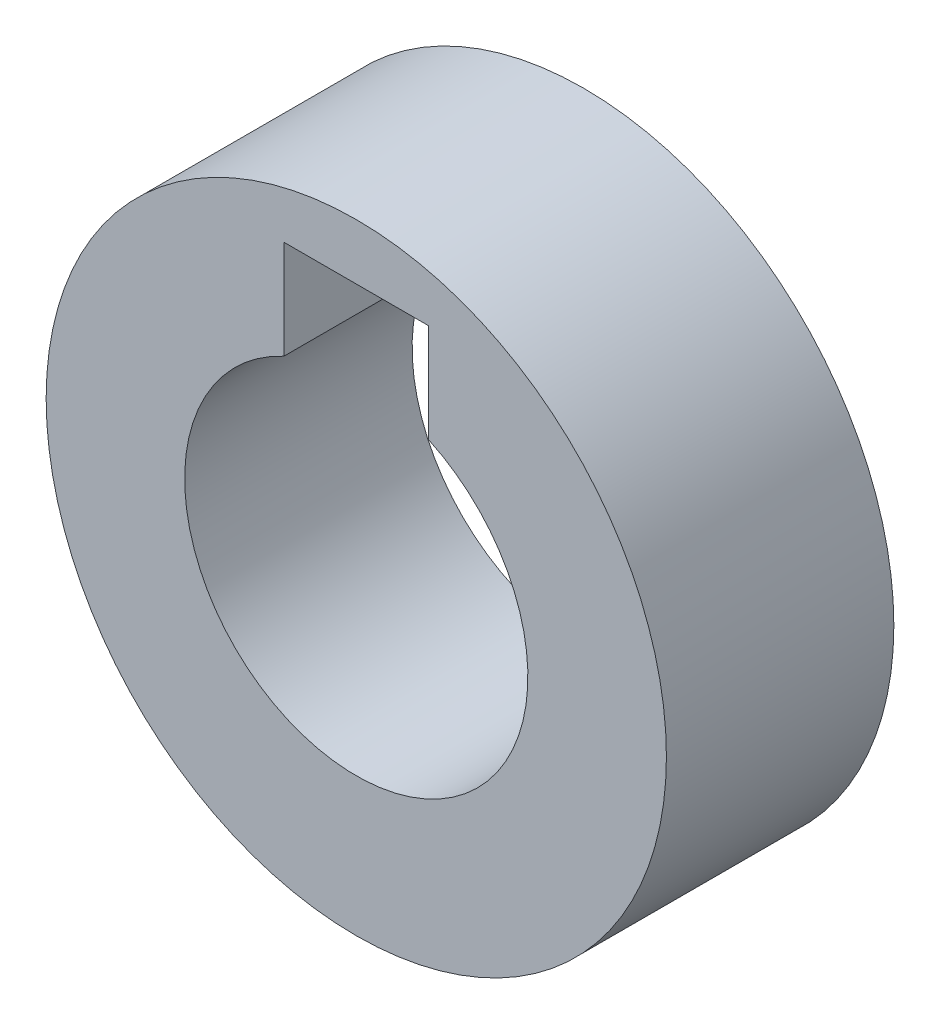
ISO-10303-21;
HEADER;
FILE_DESCRIPTION(('STEP AP214'),'2;1');
FILE_NAME('part.step','',(''),(''),'','','');
FILE_SCHEMA(('AUTOMOTIVE_DESIGN { 1 0 10303 214 1 1 1 1 }'));
ENDSEC;
DATA;
#1=APPLICATION_CONTEXT('core data for automotive mechanical design processes');
#2=APPLICATION_PROTOCOL_DEFINITION('international standard','automotive_design',2000,#1);
#3=PRODUCT_CONTEXT('',#1,'mechanical');
#4=PRODUCT('Part','Part','',(#3));
#5=PRODUCT_RELATED_PRODUCT_CATEGORY('part','',(#4));
#6=PRODUCT_DEFINITION_FORMATION('','',#4);
#7=PRODUCT_DEFINITION_CONTEXT('part definition',#1,'design');
#8=PRODUCT_DEFINITION('design','',#6,#7);
#9=PRODUCT_DEFINITION_SHAPE('','',#8);
#10=(LENGTH_UNIT() NAMED_UNIT(*) SI_UNIT(.MILLI.,.METRE.));
#11=(NAMED_UNIT(*) PLANE_ANGLE_UNIT() SI_UNIT($,.RADIAN.));
#12=(NAMED_UNIT(*) SI_UNIT($,.STERADIAN.) SOLID_ANGLE_UNIT());
#13=UNCERTAINTY_MEASURE_WITH_UNIT(LENGTH_MEASURE(1.E-05),#10,'distance_accuracy_value','');
#14=(GEOMETRIC_REPRESENTATION_CONTEXT(3) GLOBAL_UNCERTAINTY_ASSIGNED_CONTEXT((#13)) GLOBAL_UNIT_ASSIGNED_CONTEXT((#10,
#11,#12)) REPRESENTATION_CONTEXT('',''));
#15=CARTESIAN_POINT('',(0.,0.,0.));
#16=DIRECTION('',(0.,0.,1.));
#17=DIRECTION('',(1.,0.,0.));
#18=AXIS2_PLACEMENT_3D('',#15,#16,#17);
#19=CARTESIAN_POINT('',(0.,0.,5.5));
#20=DIRECTION('',(0.,0.,-1.));
#21=DIRECTION('',(-1.,0.,0.));
#22=AXIS2_PLACEMENT_3D('',#19,#20,#21);
#23=CYLINDRICAL_SURFACE('',#22,4.15);
#24=CARTESIAN_POINT('',(0.,0.,0.));
#25=DIRECTION('',(0.,0.,1.));
#26=DIRECTION('',(1.,0.,0.));
#27=AXIS2_PLACEMENT_3D('',#24,#25,#26);
#28=CIRCLE('',#27,4.15);
#29=CARTESIAN_POINT('',(-1.75,3.76297754444536,0.));
#30=VERTEX_POINT('',#29);
#31=CARTESIAN_POINT('',(1.75,3.76297754444536,0.));
#32=VERTEX_POINT('',#31);
#33=EDGE_CURVE('E108',#30,#32,#28,.T.);
#34=ORIENTED_EDGE('',*,*,#33,.F.);
#35=DIRECTION('',(0.,0.,-1.));
#36=VECTOR('',#35,1.);
#37=CARTESIAN_POINT('',(-1.75,3.76297754444536,5.5));
#38=LINE('',#37,#36);
#39=CARTESIAN_POINT('',(-1.75,3.76297754444536,5.5));
#40=VERTEX_POINT('',#39);
#41=EDGE_CURVE('E11',#40,#30,#38,.T.);
#42=ORIENTED_EDGE('',*,*,#41,.F.);
#43=CARTESIAN_POINT('',(0.,0.,5.5));
#44=DIRECTION('',(0.,0.,1.));
#45=DIRECTION('',(1.,0.,0.));
#46=AXIS2_PLACEMENT_3D('',#43,#44,#45);
#47=CIRCLE('',#46,4.15);
#48=CARTESIAN_POINT('',(1.75,3.76297754444536,5.5));
#49=VERTEX_POINT('',#48);
#50=EDGE_CURVE('E90',#40,#49,#47,.T.);
#51=ORIENTED_EDGE('',*,*,#50,.T.);
#52=DIRECTION('',(0.,0.,-1.));
#53=VECTOR('',#52,1.);
#54=CARTESIAN_POINT('',(1.75,3.76297754444536,5.5));
#55=LINE('',#54,#53);
#56=EDGE_CURVE('E57',#49,#32,#55,.T.);
#57=ORIENTED_EDGE('',*,*,#56,.T.);
#58=EDGE_LOOP('',(#34,#42,#51,#57));
#59=FACE_BOUND('',#58,.T.);
#60=ADVANCED_FACE('F41',(#59),#23,.F.);
#61=CARTESIAN_POINT('',(-1.75,0.,5.5));
#62=DIRECTION('',(-1.,0.,0.));
#63=DIRECTION('',(0.,0.,1.));
#64=AXIS2_PLACEMENT_3D('',#61,#62,#63);
#65=PLANE('',#64);
#66=DIRECTION('',(0.,1.,0.));
#67=VECTOR('',#66,1.);
#68=CARTESIAN_POINT('',(-1.75,0.,0.));
#69=LINE('',#68,#67);
#70=CARTESIAN_POINT('',(-1.75,6.15,0.));
#71=VERTEX_POINT('',#70);
#72=EDGE_CURVE('E96',#30,#71,#69,.T.);
#73=ORIENTED_EDGE('',*,*,#72,.T.);
#74=DIRECTION('',(0.,0.,-1.));
#75=VECTOR('',#74,1.);
#76=CARTESIAN_POINT('',(-1.75,6.15,5.5));
#77=LINE('',#76,#75);
#78=CARTESIAN_POINT('',(-1.75,6.15,5.5));
#79=VERTEX_POINT('',#78);
#80=EDGE_CURVE('E49',#79,#71,#77,.T.);
#81=ORIENTED_EDGE('',*,*,#80,.F.);
#82=DIRECTION('',(0.,1.,0.));
#83=VECTOR('',#82,1.);
#84=CARTESIAN_POINT('',(-1.75,0.,5.5));
#85=LINE('',#84,#83);
#86=EDGE_CURVE('E83',#40,#79,#85,.T.);
#87=ORIENTED_EDGE('',*,*,#86,.F.);
#88=ORIENTED_EDGE('',*,*,#41,.T.);
#89=EDGE_LOOP('',(#73,#81,#87,#88));
#90=FACE_BOUND('',#89,.T.);
#91=ADVANCED_FACE('F94',(#90),#65,.F.);
#92=CARTESIAN_POINT('',(0.,6.15,5.5));
#93=DIRECTION('',(0.,1.,0.));
#94=DIRECTION('',(0.,0.,1.));
#95=AXIS2_PLACEMENT_3D('',#92,#93,#94);
#96=PLANE('',#95);
#97=DIRECTION('',(1.,0.,0.));
#98=VECTOR('',#97,1.);
#99=CARTESIAN_POINT('',(0.,6.15,0.));
#100=LINE('',#99,#98);
#101=CARTESIAN_POINT('',(1.75,6.15,0.));
#102=VERTEX_POINT('',#101);
#103=EDGE_CURVE('E111',#71,#102,#100,.T.);
#104=ORIENTED_EDGE('',*,*,#103,.T.);
#105=DIRECTION('',(0.,0.,-1.));
#106=VECTOR('',#105,1.);
#107=CARTESIAN_POINT('',(1.75,6.15,5.5));
#108=LINE('',#107,#106);
#109=CARTESIAN_POINT('',(1.75,6.15,5.5));
#110=VERTEX_POINT('',#109);
#111=EDGE_CURVE('E71',#110,#102,#108,.T.);
#112=ORIENTED_EDGE('',*,*,#111,.F.);
#113=DIRECTION('',(1.,0.,0.));
#114=VECTOR('',#113,1.);
#115=CARTESIAN_POINT('',(0.,6.15,5.5));
#116=LINE('',#115,#114);
#117=EDGE_CURVE('E89',#79,#110,#116,.T.);
#118=ORIENTED_EDGE('',*,*,#117,.F.);
#119=ORIENTED_EDGE('',*,*,#80,.T.);
#120=EDGE_LOOP('',(#104,#112,#118,#119));
#121=FACE_BOUND('',#120,.T.);
#122=ADVANCED_FACE('F99',(#121),#96,.F.);
#123=CARTESIAN_POINT('',(1.75,0.,5.5));
#124=DIRECTION('',(-1.,0.,0.));
#125=DIRECTION('',(0.,0.,1.));
#126=AXIS2_PLACEMENT_3D('',#123,#124,#125);
#127=PLANE('',#126);
#128=DIRECTION('',(0.,1.,0.));
#129=VECTOR('',#128,1.);
#130=CARTESIAN_POINT('',(1.75,0.,0.));
#131=LINE('',#130,#129);
#132=EDGE_CURVE('E113',#32,#102,#131,.T.);
#133=ORIENTED_EDGE('',*,*,#132,.F.);
#134=ORIENTED_EDGE('',*,*,#56,.F.);
#135=DIRECTION('',(0.,1.,0.));
#136=VECTOR('',#135,1.);
#137=CARTESIAN_POINT('',(1.75,0.,5.5));
#138=LINE('',#137,#136);
#139=EDGE_CURVE('E100',#49,#110,#138,.T.);
#140=ORIENTED_EDGE('',*,*,#139,.T.);
#141=ORIENTED_EDGE('',*,*,#111,.T.);
#142=EDGE_LOOP('',(#133,#134,#140,#141));
#143=FACE_BOUND('',#142,.T.);
#144=ADVANCED_FACE('F122',(#143),#127,.T.);
#145=CARTESIAN_POINT('',(0.,0.,5.5));
#146=DIRECTION('',(0.,0.,-1.));
#147=DIRECTION('',(-1.,0.,0.));
#148=AXIS2_PLACEMENT_3D('',#145,#146,#147);
#149=CYLINDRICAL_SURFACE('',#148,7.5);
#150=CARTESIAN_POINT('',(0.,0.,5.5));
#151=DIRECTION('',(0.,0.,1.));
#152=DIRECTION('',(1.,0.,0.));
#153=AXIS2_PLACEMENT_3D('',#150,#151,#152);
#154=CIRCLE('',#153,7.5);
#155=CARTESIAN_POINT('',(7.5,0.,5.5));
#156=VERTEX_POINT('',#155);
#157=EDGE_CURVE('E102',#156,#156,#154,.T.);
#158=ORIENTED_EDGE('',*,*,#157,.F.);
#159=EDGE_LOOP('',(#158));
#160=FACE_BOUND('',#159,.T.);
#161=CARTESIAN_POINT('',(0.,0.,0.));
#162=DIRECTION('',(0.,0.,1.));
#163=DIRECTION('',(1.,0.,0.));
#164=AXIS2_PLACEMENT_3D('',#161,#162,#163);
#165=CIRCLE('',#164,7.5);
#166=CARTESIAN_POINT('',(7.5,0.,0.));
#167=VERTEX_POINT('',#166);
#168=EDGE_CURVE('E116',#167,#167,#165,.T.);
#169=ORIENTED_EDGE('',*,*,#168,.T.);
#170=EDGE_LOOP('',(#169));
#171=FACE_BOUND('',#170,.T.);
#172=ADVANCED_FACE('F124',(#160,#171),#149,.T.);
#173=CARTESIAN_POINT('',(0.,0.,5.5));
#174=DIRECTION('',(0.,0.,1.));
#175=DIRECTION('',(1.,0.,0.));
#176=AXIS2_PLACEMENT_3D('',#173,#174,#175);
#177=PLANE('',#176);
#178=ORIENTED_EDGE('',*,*,#50,.F.);
#179=ORIENTED_EDGE('',*,*,#86,.T.);
#180=ORIENTED_EDGE('',*,*,#117,.T.);
#181=ORIENTED_EDGE('',*,*,#139,.F.);
#182=EDGE_LOOP('',(#178,#179,#180,#181));
#183=FACE_BOUND('',#182,.T.);
#184=ORIENTED_EDGE('',*,*,#157,.T.);
#185=EDGE_LOOP('',(#184));
#186=FACE_BOUND('',#185,.T.);
#187=ADVANCED_FACE('F85',(#183,#186),#177,.T.);
#188=CARTESIAN_POINT('',(0.,0.,0.));
#189=DIRECTION('',(0.,0.,1.));
#190=DIRECTION('',(1.,0.,0.));
#191=AXIS2_PLACEMENT_3D('',#188,#189,#190);
#192=PLANE('',#191);
#193=ORIENTED_EDGE('',*,*,#33,.T.);
#194=ORIENTED_EDGE('',*,*,#132,.T.);
#195=ORIENTED_EDGE('',*,*,#103,.F.);
#196=ORIENTED_EDGE('',*,*,#72,.F.);
#197=EDGE_LOOP('',(#193,#194,#195,#196));
#198=FACE_BOUND('',#197,.T.);
#199=ORIENTED_EDGE('',*,*,#168,.F.);
#200=EDGE_LOOP('',(#199));
#201=FACE_BOUND('',#200,.T.);
#202=ADVANCED_FACE('F164',(#198,#201),#192,.F.);
#203=CLOSED_SHELL('',(#60,#91,#122,#144,#172,#187,#202));
#204=MANIFOLD_SOLID_BREP('B2',#203);
#205=ADVANCED_BREP_SHAPE_REPRESENTATION('',(#18,#204),#14);
#206=SHAPE_DEFINITION_REPRESENTATION(#9,#205);
ENDSEC;
END-ISO-10303-21;
